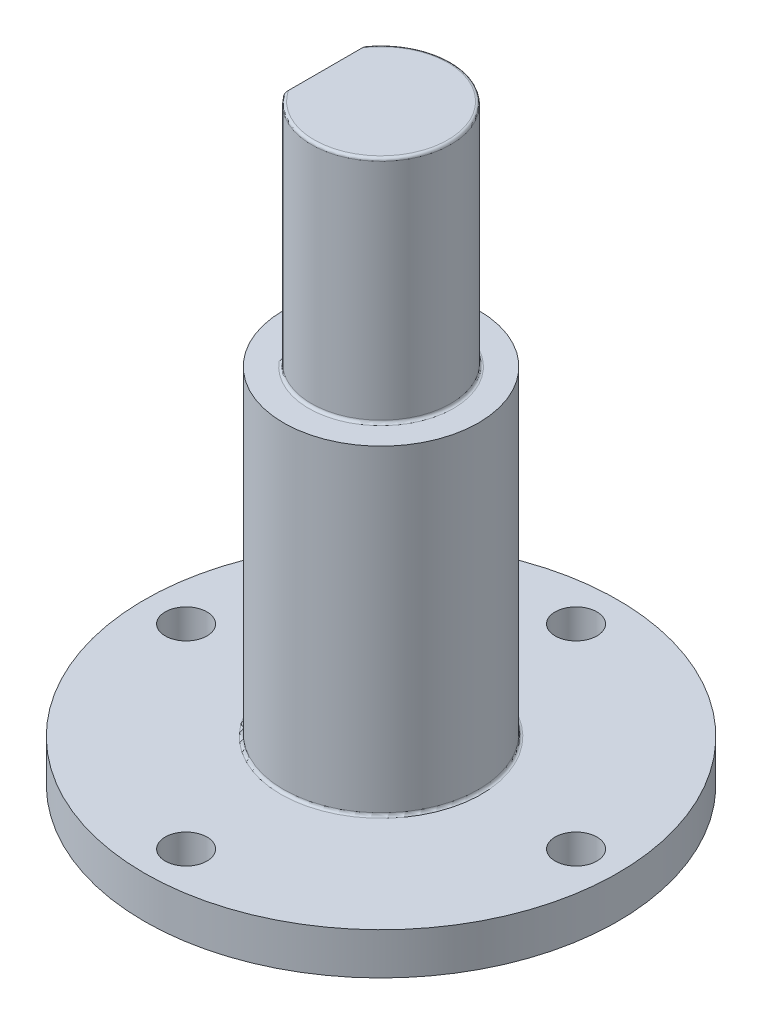
ISO-10303-21;
HEADER;
FILE_DESCRIPTION(('STEP AP214'),'2;1');
FILE_NAME('part.step','',(''),(''),'','','');
FILE_SCHEMA(('AUTOMOTIVE_DESIGN { 1 0 10303 214 1 1 1 1 }'));
ENDSEC;
DATA;
#1=APPLICATION_CONTEXT('core data for automotive mechanical design processes');
#2=APPLICATION_PROTOCOL_DEFINITION('international standard','automotive_design',2000,#1);
#3=PRODUCT_CONTEXT('',#1,'mechanical');
#4=PRODUCT('Part','Part','',(#3));
#5=PRODUCT_RELATED_PRODUCT_CATEGORY('part','',(#4));
#6=PRODUCT_DEFINITION_FORMATION('','',#4);
#7=PRODUCT_DEFINITION_CONTEXT('part definition',#1,'design');
#8=PRODUCT_DEFINITION('design','',#6,#7);
#9=PRODUCT_DEFINITION_SHAPE('','',#8);
#10=(LENGTH_UNIT() NAMED_UNIT(*) SI_UNIT(.MILLI.,.METRE.));
#11=(NAMED_UNIT(*) PLANE_ANGLE_UNIT() SI_UNIT($,.RADIAN.));
#12=(NAMED_UNIT(*) SI_UNIT($,.STERADIAN.) SOLID_ANGLE_UNIT());
#13=UNCERTAINTY_MEASURE_WITH_UNIT(LENGTH_MEASURE(1.E-05),#10,'distance_accuracy_value','');
#14=(GEOMETRIC_REPRESENTATION_CONTEXT(3) GLOBAL_UNCERTAINTY_ASSIGNED_CONTEXT((#13)) GLOBAL_UNIT_ASSIGNED_CONTEXT((#10,
#11,#12)) REPRESENTATION_CONTEXT('',''));
#15=CARTESIAN_POINT('',(0.,0.,0.));
#16=DIRECTION('',(0.,0.,1.));
#17=DIRECTION('',(1.,0.,0.));
#18=AXIS2_PLACEMENT_3D('',#15,#16,#17);
#19=CARTESIAN_POINT('',(0.,3.,0.));
#20=DIRECTION('',(0.,1.,0.));
#21=DIRECTION('',(0.,0.,1.));
#22=AXIS2_PLACEMENT_3D('',#19,#20,#21);
#23=PLANE('',#22);
#24=CARTESIAN_POINT('',(0.,3.,0.));
#25=DIRECTION('',(0.,1.,0.));
#26=DIRECTION('',(0.,0.,1.));
#27=AXIS2_PLACEMENT_3D('',#24,#25,#26);
#28=CIRCLE('',#27,7.2);
#29=CARTESIAN_POINT('',(0.,3.,7.2));
#30=VERTEX_POINT('',#29);
#31=EDGE_CURVE('E163',#30,#30,#28,.F.);
#32=ORIENTED_EDGE('',*,*,#31,.T.);
#33=EDGE_LOOP('',(#32));
#34=FACE_BOUND('',#33,.T.);
#35=CARTESIAN_POINT('',(7.90664347494893E-13,3.,14.));
#36=DIRECTION('',(0.,1.,0.));
#37=DIRECTION('',(0.,0.,1.));
#38=AXIS2_PLACEMENT_3D('',#35,#36,#37);
#39=CIRCLE('',#38,1.50000000000085);
#40=CARTESIAN_POINT('',(7.90664347494893E-13,3.,15.5000000000008));
#41=VERTEX_POINT('',#40);
#42=EDGE_CURVE('E115',#41,#41,#39,.T.);
#43=ORIENTED_EDGE('',*,*,#42,.F.);
#44=EDGE_LOOP('',(#43));
#45=FACE_BOUND('',#44,.T.);
#46=CARTESIAN_POINT('',(0.,3.,-14.));
#47=DIRECTION('',(0.,1.,0.));
#48=DIRECTION('',(0.,0.,1.));
#49=AXIS2_PLACEMENT_3D('',#46,#47,#48);
#50=CIRCLE('',#49,1.5);
#51=CARTESIAN_POINT('',(0.,3.,-12.5));
#52=VERTEX_POINT('',#51);
#53=EDGE_CURVE('E127',#52,#52,#50,.T.);
#54=ORIENTED_EDGE('',*,*,#53,.F.);
#55=EDGE_LOOP('',(#54));
#56=FACE_BOUND('',#55,.T.);
#57=CARTESIAN_POINT('',(0.,3.,0.));
#58=DIRECTION('',(0.,1.,0.));
#59=DIRECTION('',(0.,0.,1.));
#60=AXIS2_PLACEMENT_3D('',#57,#58,#59);
#61=CIRCLE('',#60,17.);
#62=CARTESIAN_POINT('',(0.,3.,17.));
#63=VERTEX_POINT('',#62);
#64=EDGE_CURVE('E93',#63,#63,#61,.T.);
#65=ORIENTED_EDGE('',*,*,#64,.T.);
#66=EDGE_LOOP('',(#65));
#67=FACE_BOUND('',#66,.T.);
#68=CARTESIAN_POINT('',(14.0000000000004,3.,-3.95332173747447E-13));
#69=DIRECTION('',(0.,1.,0.));
#70=DIRECTION('',(0.,0.,1.));
#71=AXIS2_PLACEMENT_3D('',#68,#69,#70);
#72=CIRCLE('',#71,1.50000000000031);
#73=CARTESIAN_POINT('',(14.0000000000004,3.,1.49999999999991));
#74=VERTEX_POINT('',#73);
#75=EDGE_CURVE('E121',#74,#74,#72,.T.);
#76=ORIENTED_EDGE('',*,*,#75,.F.);
#77=EDGE_LOOP('',(#76));
#78=FACE_BOUND('',#77,.T.);
#79=CARTESIAN_POINT('',(-13.9999999999996,3.,3.97046679266253E-13));
#80=DIRECTION('',(0.,1.,0.));
#81=DIRECTION('',(0.,0.,1.));
#82=AXIS2_PLACEMENT_3D('',#79,#80,#81);
#83=CIRCLE('',#82,1.50000000000064);
#84=CARTESIAN_POINT('',(-13.9999999999996,3.,1.50000000000103));
#85=VERTEX_POINT('',#84);
#86=EDGE_CURVE('E109',#85,#85,#83,.T.);
#87=ORIENTED_EDGE('',*,*,#86,.F.);
#88=EDGE_LOOP('',(#87));
#89=FACE_BOUND('',#88,.T.);
#90=ADVANCED_FACE('F35',(#34,#45,#56,#67,#78,#89),#23,.T.);
#91=CARTESIAN_POINT('',(0.,0.,0.));
#92=DIRECTION('',(0.,1.,0.));
#93=DIRECTION('',(0.,0.,1.));
#94=AXIS2_PLACEMENT_3D('',#91,#92,#93);
#95=PLANE('',#94);
#96=CARTESIAN_POINT('',(0.,0.,0.));
#97=DIRECTION('',(0.,1.,0.));
#98=DIRECTION('',(0.,0.,1.));
#99=AXIS2_PLACEMENT_3D('',#96,#97,#98);
#100=CIRCLE('',#99,17.);
#101=CARTESIAN_POINT('',(0.,0.,17.));
#102=VERTEX_POINT('',#101);
#103=EDGE_CURVE('E130',#102,#102,#100,.T.);
#104=ORIENTED_EDGE('',*,*,#103,.F.);
#105=EDGE_LOOP('',(#104));
#106=FACE_BOUND('',#105,.T.);
#107=CARTESIAN_POINT('',(0.,0.,-14.));
#108=DIRECTION('',(0.,1.,0.));
#109=DIRECTION('',(0.,0.,1.));
#110=AXIS2_PLACEMENT_3D('',#107,#108,#109);
#111=CIRCLE('',#110,1.5);
#112=CARTESIAN_POINT('',(0.,0.,-12.5));
#113=VERTEX_POINT('',#112);
#114=EDGE_CURVE('E124',#113,#113,#111,.T.);
#115=ORIENTED_EDGE('',*,*,#114,.T.);
#116=EDGE_LOOP('',(#115));
#117=FACE_BOUND('',#116,.T.);
#118=CARTESIAN_POINT('',(14.0000000000004,0.,-3.95332173747447E-13));
#119=DIRECTION('',(0.,1.,0.));
#120=DIRECTION('',(0.,0.,1.));
#121=AXIS2_PLACEMENT_3D('',#118,#119,#120);
#122=CIRCLE('',#121,1.50000000000031);
#123=CARTESIAN_POINT('',(14.0000000000004,0.,1.49999999999991));
#124=VERTEX_POINT('',#123);
#125=EDGE_CURVE('E118',#124,#124,#122,.T.);
#126=ORIENTED_EDGE('',*,*,#125,.T.);
#127=EDGE_LOOP('',(#126));
#128=FACE_BOUND('',#127,.T.);
#129=CARTESIAN_POINT('',(7.90664347494893E-13,0.,14.));
#130=DIRECTION('',(0.,1.,0.));
#131=DIRECTION('',(0.,0.,1.));
#132=AXIS2_PLACEMENT_3D('',#129,#130,#131);
#133=CIRCLE('',#132,1.50000000000085);
#134=CARTESIAN_POINT('',(7.90664347494893E-13,0.,15.5000000000008));
#135=VERTEX_POINT('',#134);
#136=EDGE_CURVE('E112',#135,#135,#133,.T.);
#137=ORIENTED_EDGE('',*,*,#136,.T.);
#138=EDGE_LOOP('',(#137));
#139=FACE_BOUND('',#138,.T.);
#140=CARTESIAN_POINT('',(-13.9999999999996,0.,3.97046679266253E-13));
#141=DIRECTION('',(0.,1.,0.));
#142=DIRECTION('',(0.,0.,1.));
#143=AXIS2_PLACEMENT_3D('',#140,#141,#142);
#144=CIRCLE('',#143,1.50000000000064);
#145=CARTESIAN_POINT('',(-13.9999999999996,0.,1.50000000000103));
#146=VERTEX_POINT('',#145);
#147=EDGE_CURVE('E108',#146,#146,#144,.T.);
#148=ORIENTED_EDGE('',*,*,#147,.T.);
#149=EDGE_LOOP('',(#148));
#150=FACE_BOUND('',#149,.T.);
#151=ADVANCED_FACE('F177',(#106,#117,#128,#139,#150),#95,.F.);
#152=CARTESIAN_POINT('',(0.,3.,0.));
#153=DIRECTION('',(0.,-1.,0.));
#154=DIRECTION('',(0.,0.,-1.));
#155=AXIS2_PLACEMENT_3D('',#152,#153,#154);
#156=CYLINDRICAL_SURFACE('',#155,17.);
#157=ORIENTED_EDGE('',*,*,#64,.F.);
#158=EDGE_LOOP('',(#157));
#159=FACE_BOUND('',#158,.T.);
#160=ORIENTED_EDGE('',*,*,#103,.T.);
#161=EDGE_LOOP('',(#160));
#162=FACE_BOUND('',#161,.T.);
#163=ADVANCED_FACE('F183',(#159,#162),#156,.T.);
#164=CARTESIAN_POINT('',(0.,3.,-14.));
#165=DIRECTION('',(0.,-1.,0.));
#166=DIRECTION('',(0.,0.,-1.));
#167=AXIS2_PLACEMENT_3D('',#164,#165,#166);
#168=CYLINDRICAL_SURFACE('',#167,1.5);
#169=ORIENTED_EDGE('',*,*,#53,.T.);
#170=EDGE_LOOP('',(#169));
#171=FACE_BOUND('',#170,.T.);
#172=ORIENTED_EDGE('',*,*,#114,.F.);
#173=EDGE_LOOP('',(#172));
#174=FACE_BOUND('',#173,.T.);
#175=ADVANCED_FACE('F189',(#171,#174),#168,.F.);
#176=CARTESIAN_POINT('',(14.0000000000004,3.,-3.95332173747447E-13));
#177=DIRECTION('',(0.,-1.,0.));
#178=DIRECTION('',(0.,0.,-1.));
#179=AXIS2_PLACEMENT_3D('',#176,#177,#178);
#180=CYLINDRICAL_SURFACE('',#179,1.50000000000031);
#181=ORIENTED_EDGE('',*,*,#75,.T.);
#182=EDGE_LOOP('',(#181));
#183=FACE_BOUND('',#182,.T.);
#184=ORIENTED_EDGE('',*,*,#125,.F.);
#185=EDGE_LOOP('',(#184));
#186=FACE_BOUND('',#185,.T.);
#187=ADVANCED_FACE('F196',(#183,#186),#180,.F.);
#188=CARTESIAN_POINT('',(7.90664347494893E-13,3.,14.));
#189=DIRECTION('',(0.,-1.,0.));
#190=DIRECTION('',(0.,0.,-1.));
#191=AXIS2_PLACEMENT_3D('',#188,#189,#190);
#192=CYLINDRICAL_SURFACE('',#191,1.50000000000085);
#193=ORIENTED_EDGE('',*,*,#42,.T.);
#194=EDGE_LOOP('',(#193));
#195=FACE_BOUND('',#194,.T.);
#196=ORIENTED_EDGE('',*,*,#136,.F.);
#197=EDGE_LOOP('',(#196));
#198=FACE_BOUND('',#197,.T.);
#199=ADVANCED_FACE('F213',(#195,#198),#192,.F.);
#200=CARTESIAN_POINT('',(-13.9999999999996,3.,3.97046679266253E-13));
#201=DIRECTION('',(0.,-1.,0.));
#202=DIRECTION('',(0.,0.,-1.));
#203=AXIS2_PLACEMENT_3D('',#200,#201,#202);
#204=CYLINDRICAL_SURFACE('',#203,1.50000000000064);
#205=ORIENTED_EDGE('',*,*,#86,.T.);
#206=EDGE_LOOP('',(#205));
#207=FACE_BOUND('',#206,.T.);
#208=ORIENTED_EDGE('',*,*,#147,.F.);
#209=EDGE_LOOP('',(#208));
#210=FACE_BOUND('',#209,.T.);
#211=ADVANCED_FACE('F210',(#207,#210),#204,.F.);
#212=CARTESIAN_POINT('',(0.,26.,0.));
#213=DIRECTION('',(0.,-1.,0.));
#214=DIRECTION('',(0.,0.,-1.));
#215=AXIS2_PLACEMENT_3D('',#212,#213,#214);
#216=CYLINDRICAL_SURFACE('',#215,7.);
#217=CARTESIAN_POINT('',(0.,3.2,0.));
#218=DIRECTION('',(0.,1.,0.));
#219=DIRECTION('',(0.,0.,1.));
#220=AXIS2_PLACEMENT_3D('',#217,#218,#219);
#221=CIRCLE('',#220,7.);
#222=CARTESIAN_POINT('',(0.,3.2,7.));
#223=VERTEX_POINT('',#222);
#224=EDGE_CURVE('E310',#223,#223,#221,.T.);
#225=ORIENTED_EDGE('',*,*,#224,.T.);
#226=EDGE_LOOP('',(#225));
#227=FACE_BOUND('',#226,.T.);
#228=CARTESIAN_POINT('',(0.,26.,0.));
#229=DIRECTION('',(0.,1.,0.));
#230=DIRECTION('',(0.,0.,1.));
#231=AXIS2_PLACEMENT_3D('',#228,#229,#230);
#232=CIRCLE('',#231,7.);
#233=CARTESIAN_POINT('',(0.,26.,7.));
#234=VERTEX_POINT('',#233);
#235=EDGE_CURVE('E105',#234,#234,#232,.T.);
#236=ORIENTED_EDGE('',*,*,#235,.F.);
#237=EDGE_LOOP('',(#236));
#238=FACE_BOUND('',#237,.T.);
#239=ADVANCED_FACE('F212',(#227,#238),#216,.T.);
#240=CARTESIAN_POINT('',(0.,26.,0.));
#241=DIRECTION('',(0.,1.,0.));
#242=DIRECTION('',(0.,0.,1.));
#243=AXIS2_PLACEMENT_3D('',#240,#241,#242);
#244=PLANE('',#243);
#245=DIRECTION('',(0.,0.,1.));
#246=VECTOR('',#245,1.);
#247=CARTESIAN_POINT('',(-4.,26.,0.));
#248=LINE('',#247,#246);
#249=CARTESIAN_POINT('',(-4.,26.,-3.32264954516723));
#250=VERTEX_POINT('',#249);
#251=CARTESIAN_POINT('',(-4.,26.,3.32264954516723));
#252=VERTEX_POINT('',#251);
#253=EDGE_CURVE('E54',#250,#252,#248,.T.);
#254=ORIENTED_EDGE('',*,*,#253,.F.);
#255=CARTESIAN_POINT('',(0.,26.,0.));
#256=DIRECTION('',(0.,1.,0.));
#257=DIRECTION('',(0.,0.,1.));
#258=AXIS2_PLACEMENT_3D('',#255,#256,#257);
#259=CIRCLE('',#258,5.2);
#260=EDGE_CURVE('E309',#250,#252,#259,.F.);
#261=ORIENTED_EDGE('',*,*,#260,.T.);
#262=EDGE_LOOP('',(#254,#261));
#263=FACE_BOUND('',#262,.T.);
#264=ORIENTED_EDGE('',*,*,#235,.T.);
#265=EDGE_LOOP('',(#264));
#266=FACE_BOUND('',#265,.T.);
#267=ADVANCED_FACE('F220',(#263,#266),#244,.T.);
#268=CARTESIAN_POINT('',(0.,42.5,0.));
#269=DIRECTION('',(0.,-1.,0.));
#270=DIRECTION('',(0.,0.,-1.));
#271=AXIS2_PLACEMENT_3D('',#268,#269,#270);
#272=CYLINDRICAL_SURFACE('',#271,5.);
#273=DIRECTION('',(0.,-1.,0.));
#274=VECTOR('',#273,1.);
#275=CARTESIAN_POINT('',(-4.,42.5,-3.));
#276=LINE('',#275,#274);
#277=CARTESIAN_POINT('',(-4.,42.3,-3.));
#278=VERTEX_POINT('',#277);
#279=CARTESIAN_POINT('',(-4.,26.2,-3.));
#280=VERTEX_POINT('',#279);
#281=EDGE_CURVE('E97',#278,#280,#276,.T.);
#282=ORIENTED_EDGE('',*,*,#281,.F.);
#283=CARTESIAN_POINT('',(0.,42.3,0.));
#284=DIRECTION('',(0.,1.,0.));
#285=DIRECTION('',(0.,0.,1.));
#286=AXIS2_PLACEMENT_3D('',#283,#284,#285);
#287=CIRCLE('',#286,5.);
#288=CARTESIAN_POINT('',(-4.,42.3,3.));
#289=VERTEX_POINT('',#288);
#290=EDGE_CURVE('E82',#278,#289,#287,.F.);
#291=ORIENTED_EDGE('',*,*,#290,.T.);
#292=DIRECTION('',(0.,-1.,0.));
#293=VECTOR('',#292,1.);
#294=CARTESIAN_POINT('',(-4.,42.5,3.));
#295=LINE('',#294,#293);
#296=CARTESIAN_POINT('',(-4.,26.2,3.));
#297=VERTEX_POINT('',#296);
#298=EDGE_CURVE('E99',#289,#297,#295,.T.);
#299=ORIENTED_EDGE('',*,*,#298,.T.);
#300=CARTESIAN_POINT('',(0.,26.2,0.));
#301=DIRECTION('',(0.,1.,0.));
#302=DIRECTION('',(0.,0.,1.));
#303=AXIS2_PLACEMENT_3D('',#300,#301,#302);
#304=CIRCLE('',#303,5.);
#305=EDGE_CURVE('E86',#297,#280,#304,.T.);
#306=ORIENTED_EDGE('',*,*,#305,.T.);
#307=EDGE_LOOP('',(#282,#291,#299,#306));
#308=FACE_BOUND('',#307,.T.);
#309=ADVANCED_FACE('F153',(#308),#272,.T.);
#310=CARTESIAN_POINT('',(-4.,42.5,0.));
#311=DIRECTION('',(1.,0.,0.));
#312=DIRECTION('',(0.,0.,-1.));
#313=AXIS2_PLACEMENT_3D('',#310,#311,#312);
#314=PLANE('',#313);
#315=DIRECTION('',(0.,0.,1.));
#316=VECTOR('',#315,1.);
#317=CARTESIAN_POINT('',(-4.,42.5,0.));
#318=LINE('',#317,#316);
#319=CARTESIAN_POINT('',(-4.,42.5,-2.65329983228432));
#320=VERTEX_POINT('',#319);
#321=CARTESIAN_POINT('',(-4.,42.5,2.65329983228432));
#322=VERTEX_POINT('',#321);
#323=EDGE_CURVE('E92',#320,#322,#318,.T.);
#324=ORIENTED_EDGE('',*,*,#323,.F.);
#325=CARTESIAN_POINT('',(-4.,42.5,-2.65329983228432));
#326=CARTESIAN_POINT('',(-4.,42.4999909397497,-2.67018460211489));
#327=CARTESIAN_POINT('',(-4.,42.4993456860189,-2.68708014690272));
#328=CARTESIAN_POINT('',(-4.,42.4966612684793,-2.72084371921511));
#329=CARTESIAN_POINT('',(-4.,42.4946151310237,-2.73771118389675));
#330=CARTESIAN_POINT('',(-4.,42.4889797576947,-2.77134917008798));
#331=CARTESIAN_POINT('',(-4.,42.4853767111755,-2.78811742925047));
#332=CARTESIAN_POINT('',(-4.,42.4764343597862,-2.82115697342095));
#333=CARTESIAN_POINT('',(-4.,42.4710992108099,-2.83742934700411));
#334=CARTESIAN_POINT('',(-4.,42.4603736006065,-2.86426502704232));
#335=CARTESIAN_POINT('',(-4.,42.4555099131018,-2.87503837363403));
#336=CARTESIAN_POINT('',(-4.,42.4446985829783,-2.89602518958083));
#337=CARTESIAN_POINT('',(-4.,42.4387518641068,-2.90623912648828));
#338=CARTESIAN_POINT('',(-4.,42.4255717570781,-2.92594643841764));
#339=CARTESIAN_POINT('',(-4.,42.4183272873112,-2.93543251387715));
#340=CARTESIAN_POINT('',(-4.,42.4024390168938,-2.95316776772792));
#341=CARTESIAN_POINT('',(-4.,42.3937974203257,-2.96141885556156));
#342=CARTESIAN_POINT('',(-4.,42.3781187246668,-2.97366817573971));
#343=CARTESIAN_POINT('',(-4.,42.3714806891998,-2.97817489682126));
#344=CARTESIAN_POINT('',(-4.,42.357595193769,-2.98609340521567));
#345=CARTESIAN_POINT('',(-4.,42.3503497064658,-2.98950857573171));
#346=CARTESIAN_POINT('',(-4.,42.3360352301986,-2.99474718296787));
#347=CARTESIAN_POINT('',(-4.,42.3290092796703,-2.99668641588817));
#348=CARTESIAN_POINT('',(-4.,42.3146636005079,-2.99932729362086));
#349=CARTESIAN_POINT('',(-4.,42.3073417425839,-3.00001722338761));
#350=CARTESIAN_POINT('',(-4.,42.3,-3.));
#351=B_SPLINE_CURVE_WITH_KNOTS('',3,(#325,#326,#327,#328,#329,#330,#331,#332,#333,#334,#335,
#336,#337,#338,#339,#340,#341,#342,#343,#344,#345,#346,#347,#348,#349,#350),.UNSPECIFIED.,.F.,
.F.,(4,2,2,2,2,2,2,2,2,2,2,2,4),(0.,0.0506591045258778,0.101572243135622,0.152946591508502,
0.204198575474328,0.239609464051259,0.274990289958324,0.310689041561349,0.346332015341484,
0.370322405479917,0.394237700920658,0.41599564610497,0.437956585068891),.UNSPECIFIED.);
#352=EDGE_CURVE('E77',#320,#278,#351,.T.);
#353=ORIENTED_EDGE('',*,*,#352,.T.);
#354=ORIENTED_EDGE('',*,*,#281,.T.);
#355=CARTESIAN_POINT('',(-4.,26.2,-3.));
#356=CARTESIAN_POINT('',(-4.,26.191717424994,-2.99997305603703));
#357=CARTESIAN_POINT('',(-4.,26.1834700827586,-3.00085571799745));
#358=CARTESIAN_POINT('',(-4.,26.1674002978231,-3.00419050095672));
#359=CARTESIAN_POINT('',(-4.,26.1595738507746,-3.00662299816944));
#360=CARTESIAN_POINT('',(-4.,26.1445189834667,-3.01280341941744));
#361=CARTESIAN_POINT('',(-4.,26.1372878307573,-3.01654486505684));
#362=CARTESIAN_POINT('',(-4.,26.1234498936441,-3.02507184289257));
#363=CARTESIAN_POINT('',(-4.,26.1168452949298,-3.02986085032904));
#364=CARTESIAN_POINT('',(-4.,26.1007413868697,-3.04317706110743));
#365=CARTESIAN_POINT('',(-4.,26.0917235188886,-3.05228441586232));
#366=CARTESIAN_POINT('',(-4.,26.0752003129206,-3.07177140233498));
#367=CARTESIAN_POINT('',(-4.,26.0676984231586,-3.08215385007804));
#368=CARTESIAN_POINT('',(-4.,26.0500797379847,-3.11003964040227));
#369=CARTESIAN_POINT('',(-4.,26.0409722346937,-3.12817858459879));
#370=CARTESIAN_POINT('',(-4.,26.0256204159251,-3.16563650206328));
#371=CARTESIAN_POINT('',(-4.,26.0193840437586,-3.18495858348351));
#372=CARTESIAN_POINT('',(-4.,26.0095749826316,-3.22395970679576));
#373=CARTESIAN_POINT('',(-4.,26.0059648783325,-3.24362947215401));
#374=CARTESIAN_POINT('',(-4.,26.0011993524624,-3.28308914883206));
#375=CARTESIAN_POINT('',(-4.,26.0000224184659,-3.30287644230332));
#376=CARTESIAN_POINT('',(-4.,26.,-3.32264954516723));
#377=B_SPLINE_CURVE_WITH_KNOTS('',3,(#355,#356,#357,#358,#359,#360,#361,#362,#363,#364,#365,
#366,#367,#368,#369,#370,#371,#372,#373,#374,#375,#376),.UNSPECIFIED.,.F.,.F.,(4,2,2,2,2,2,2,2,
2,2,4),(0.,0.0247450447289947,0.049182834548231,0.0735013463371893,0.0979017914539765,
0.136134295825845,0.174452808059044,0.235010539368725,0.295734818346779,0.355576072708246,
0.414885948861049),.UNSPECIFIED.);
#378=EDGE_CURVE('E48',#280,#250,#377,.T.);
#379=ORIENTED_EDGE('',*,*,#378,.T.);
#380=ORIENTED_EDGE('',*,*,#253,.T.);
#381=CARTESIAN_POINT('',(-4.,26.,3.32264954516723));
#382=CARTESIAN_POINT('',(-4.,26.0000048431,3.30900986890716));
#383=CARTESIAN_POINT('',(-4.,26.0005691854678,3.29538251311885));
#384=CARTESIAN_POINT('',(-4.,26.0028285988155,3.26819653960286));
#385=CARTESIAN_POINT('',(-4.,26.0045257724508,3.25463809702692));
#386=CARTESIAN_POINT('',(-4.,26.0113752916218,3.21394623461342));
#387=CARTESIAN_POINT('',(-4.,26.0182861761778,3.18706543653293));
#388=CARTESIAN_POINT('',(-4.,26.0331972620579,3.1463437496257));
#389=CARTESIAN_POINT('',(-4.,26.0394609608068,3.13185205466259));
#390=CARTESIAN_POINT('',(-4.,26.0538751189373,3.10385735003173));
#391=CARTESIAN_POINT('',(-4.,26.0620197786876,3.09035146588366));
#392=CARTESIAN_POINT('',(-4.,26.0778660285184,3.0684909960743));
#393=CARTESIAN_POINT('',(-4.,26.0850437572451,3.05975844693583));
#394=CARTESIAN_POINT('',(-4.,26.1006302528327,3.04345329785471));
#395=CARTESIAN_POINT('',(-4.,26.1090374394145,3.0358792340494));
#396=CARTESIAN_POINT('',(-4.,26.1245952931707,3.02430936480354));
#397=CARTESIAN_POINT('',(-4.,26.1314403740302,3.01990512618778));
#398=CARTESIAN_POINT('',(-4.,26.1457336054013,3.0122474892269));
#399=CARTESIAN_POINT('',(-4.,26.1531797540815,3.00899044996921));
#400=CARTESIAN_POINT('',(-4.,26.167139843092,3.00435636542381));
#401=CARTESIAN_POINT('',(-4.,26.1735752187361,3.00274443505519));
#402=CARTESIAN_POINT('',(-4.,26.1866680811922,3.00055603307949));
#403=CARTESIAN_POINT('',(-4.,26.1933268855201,2.99998753411733));
#404=CARTESIAN_POINT('',(-4.,26.2,3.));
#405=B_SPLINE_CURVE_WITH_KNOTS('',3,(#381,#382,#383,#384,#385,#386,#387,#388,#389,#390,#391,
#392,#393,#394,#395,#396,#397,#398,#399,#400,#401,#402,#403,#404),.UNSPECIFIED.,.F.,.F.,(4,2,2,
2,2,2,2,2,2,2,2,4),(0.,0.0408826509360448,0.081841396220811,0.164557389156487,0.211820057200258,
0.258938899598314,0.292757621515537,0.326533250623381,0.350868473958172,0.375125752543961,
0.394946727263107,0.414918529380082),.UNSPECIFIED.);
#406=EDGE_CURVE('E11',#252,#297,#405,.T.);
#407=ORIENTED_EDGE('',*,*,#406,.T.);
#408=ORIENTED_EDGE('',*,*,#298,.F.);
#409=CARTESIAN_POINT('',(-4.,42.3,3.));
#410=CARTESIAN_POINT('',(-4.,42.3081932286535,3.00002536711784));
#411=CARTESIAN_POINT('',(-4.,42.3163547391655,2.99916269012757));
#412=CARTESIAN_POINT('',(-4.,42.3322671268852,2.99589260199566));
#413=CARTESIAN_POINT('',(-4.,42.340021705638,2.99350348493041));
#414=CARTESIAN_POINT('',(-4.,42.354944561251,2.98741583465136));
#415=CARTESIAN_POINT('',(-4.,42.3621152763191,2.98372313123504));
#416=CARTESIAN_POINT('',(-4.,42.3758291539995,2.97528954294094));
#417=CARTESIAN_POINT('',(-4.,42.3823702658723,2.97054538867007));
#418=CARTESIAN_POINT('',(-4.,42.3980819152797,2.95751509624009));
#419=CARTESIAN_POINT('',(-4.,42.4068012571879,2.94868690063917));
#420=CARTESIAN_POINT('',(-4.,42.422764256265,2.92979695920041));
#421=CARTESIAN_POINT('',(-4.,42.4300049444504,2.91973279527082));
#422=CARTESIAN_POINT('',(-4.,42.4472575782859,2.89231352531847));
#423=CARTESIAN_POINT('',(-4.,42.4562144771135,2.87429827277121));
#424=CARTESIAN_POINT('',(-4.,42.4713584807479,2.83710882922699));
#425=CARTESIAN_POINT('',(-4.,42.4775333693442,2.81792993840317));
#426=CARTESIAN_POINT('',(-4.,42.4886554954009,2.77462667086146));
#427=CARTESIAN_POINT('',(-4.,42.4930192311255,2.75035561857361));
#428=CARTESIAN_POINT('',(-4.,42.4986490687908,2.70179572524348));
#429=CARTESIAN_POINT('',(-4.,42.4999581886142,2.6775120097685));
#430=CARTESIAN_POINT('',(-4.,42.5,2.65329983228432));
#431=B_SPLINE_CURVE_WITH_KNOTS('',3,(#409,#410,#411,#412,#413,#414,#415,#416,#417,#418,#419,
#420,#421,#422,#423,#424,#425,#426,#427,#428,#429,#430),.UNSPECIFIED.,.F.,.F.,(4,2,2,2,2,2,2,2,
2,2,4),(0.,0.024484144698867,0.0486802198018228,0.0727694300256954,0.0969346214431663,
0.133948763161868,0.171036510124993,0.231058233590226,0.291341011919063,0.365107148912236,
0.437828004820608),.UNSPECIFIED.);
#432=EDGE_CURVE('E87',#289,#322,#431,.T.);
#433=ORIENTED_EDGE('',*,*,#432,.T.);
#434=EDGE_LOOP('',(#324,#353,#354,#379,#380,#407,#408,#433));
#435=FACE_BOUND('',#434,.T.);
#436=ADVANCED_FACE('F95',(#435),#314,.F.);
#437=CARTESIAN_POINT('',(0.,42.5,0.));
#438=DIRECTION('',(0.,1.,0.));
#439=DIRECTION('',(0.,0.,1.));
#440=AXIS2_PLACEMENT_3D('',#437,#438,#439);
#441=PLANE('',#440);
#442=ORIENTED_EDGE('',*,*,#323,.T.);
#443=CARTESIAN_POINT('',(0.,42.5,0.));
#444=DIRECTION('',(0.,1.,0.));
#445=DIRECTION('',(0.,0.,1.));
#446=AXIS2_PLACEMENT_3D('',#443,#444,#445);
#447=CIRCLE('',#446,4.8);
#448=EDGE_CURVE('E81',#322,#320,#447,.T.);
#449=ORIENTED_EDGE('',*,*,#448,.T.);
#450=EDGE_LOOP('',(#442,#449));
#451=FACE_BOUND('',#450,.T.);
#452=ADVANCED_FACE('F91',(#451),#441,.T.);
#453=CARTESIAN_POINT('',(0.,42.3,0.));
#454=DIRECTION('',(0.,1.,0.));
#455=DIRECTION('',(0.,0.,1.));
#456=AXIS2_PLACEMENT_3D('',#453,#454,#455);
#457=TOROIDAL_SURFACE('',#456,4.8,0.2);
#458=ORIENTED_EDGE('',*,*,#432,.F.);
#459=ORIENTED_EDGE('',*,*,#290,.F.);
#460=ORIENTED_EDGE('',*,*,#352,.F.);
#461=ORIENTED_EDGE('',*,*,#448,.F.);
#462=EDGE_LOOP('',(#458,#459,#460,#461));
#463=FACE_BOUND('',#462,.T.);
#464=ADVANCED_FACE('F80',(#463),#457,.T.);
#465=CARTESIAN_POINT('',(0.,26.2,0.));
#466=DIRECTION('',(0.,1.,0.));
#467=DIRECTION('',(0.,0.,1.));
#468=AXIS2_PLACEMENT_3D('',#465,#466,#467);
#469=TOROIDAL_SURFACE('',#468,5.2,0.2);
#470=ORIENTED_EDGE('',*,*,#406,.F.);
#471=ORIENTED_EDGE('',*,*,#260,.F.);
#472=ORIENTED_EDGE('',*,*,#378,.F.);
#473=ORIENTED_EDGE('',*,*,#305,.F.);
#474=EDGE_LOOP('',(#470,#471,#472,#473));
#475=FACE_BOUND('',#474,.T.);
#476=ADVANCED_FACE('F165',(#475),#469,.F.);
#477=CARTESIAN_POINT('',(0.,3.2,0.));
#478=DIRECTION('',(0.,1.,0.));
#479=DIRECTION('',(0.,0.,1.));
#480=AXIS2_PLACEMENT_3D('',#477,#478,#479);
#481=TOROIDAL_SURFACE('',#480,7.2,0.2);
#482=ORIENTED_EDGE('',*,*,#31,.F.);
#483=EDGE_LOOP('',(#482));
#484=FACE_BOUND('',#483,.T.);
#485=ORIENTED_EDGE('',*,*,#224,.F.);
#486=EDGE_LOOP('',(#485));
#487=FACE_BOUND('',#486,.T.);
#488=ADVANCED_FACE('F37',(#484,#487),#481,.F.);
#489=CLOSED_SHELL('',(#90,#151,#163,#175,#187,#199,#211,#239,#267,#309,#436,#452,#464,#476,#488));
#490=MANIFOLD_SOLID_BREP('B2',#489);
#491=ADVANCED_BREP_SHAPE_REPRESENTATION('',(#18,#490),#14);
#492=SHAPE_DEFINITION_REPRESENTATION(#9,#491);
ENDSEC;
END-ISO-10303-21;
